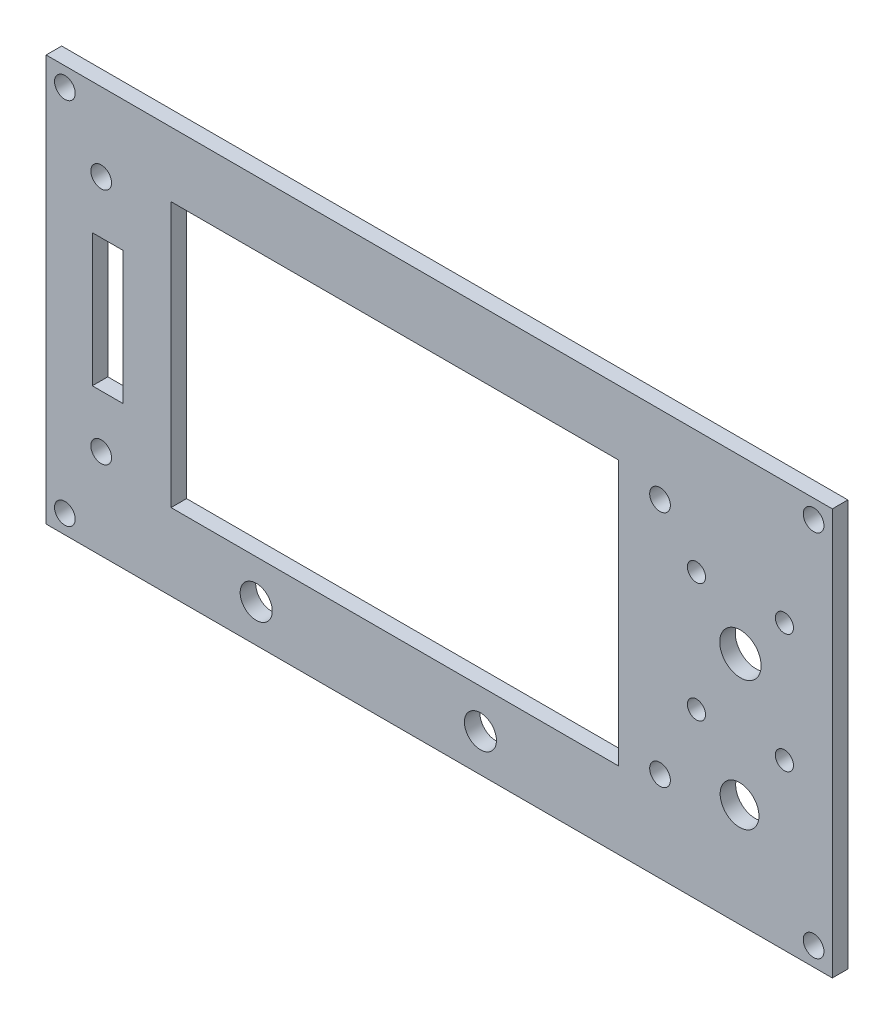
ISO-10303-21;
HEADER;
FILE_DESCRIPTION(('STEP AP214'),'2;1');
FILE_NAME('part.step','',(''),(''),'','','');
FILE_SCHEMA(('AUTOMOTIVE_DESIGN { 1 0 10303 214 1 1 1 1 }'));
ENDSEC;
DATA;
#1=APPLICATION_CONTEXT('core data for automotive mechanical design processes');
#2=APPLICATION_PROTOCOL_DEFINITION('international standard','automotive_design',2000,#1);
#3=PRODUCT_CONTEXT('',#1,'mechanical');
#4=PRODUCT('Part','Part','',(#3));
#5=PRODUCT_RELATED_PRODUCT_CATEGORY('part','',(#4));
#6=PRODUCT_DEFINITION_FORMATION('','',#4);
#7=PRODUCT_DEFINITION_CONTEXT('part definition',#1,'design');
#8=PRODUCT_DEFINITION('design','',#6,#7);
#9=PRODUCT_DEFINITION_SHAPE('','',#8);
#10=(LENGTH_UNIT() NAMED_UNIT(*) SI_UNIT(.MILLI.,.METRE.));
#11=(NAMED_UNIT(*) PLANE_ANGLE_UNIT() SI_UNIT($,.RADIAN.));
#12=(NAMED_UNIT(*) SI_UNIT($,.STERADIAN.) SOLID_ANGLE_UNIT());
#13=UNCERTAINTY_MEASURE_WITH_UNIT(LENGTH_MEASURE(1.E-05),#10,'distance_accuracy_value','');
#14=(GEOMETRIC_REPRESENTATION_CONTEXT(3) GLOBAL_UNCERTAINTY_ASSIGNED_CONTEXT((#13)) GLOBAL_UNIT_ASSIGNED_CONTEXT((#10,
#11,#12)) REPRESENTATION_CONTEXT('',''));
#15=CARTESIAN_POINT('',(0.,0.,0.));
#16=DIRECTION('',(0.,0.,1.));
#17=DIRECTION('',(1.,0.,0.));
#18=AXIS2_PLACEMENT_3D('',#15,#16,#17);
#19=CARTESIAN_POINT('',(0.,0.,0.8));
#20=DIRECTION('',(0.,0.,1.));
#21=DIRECTION('',(1.,0.,0.));
#22=AXIS2_PLACEMENT_3D('',#19,#20,#21);
#23=PLANE('',#22);
#24=CARTESIAN_POINT('',(14.1765521793274,-18.6113828011496,0.8));
#25=DIRECTION('',(0.,0.,1.));
#26=DIRECTION('',(1.,0.,0.));
#27=AXIS2_PLACEMENT_3D('',#24,#25,#26);
#28=CIRCLE('',#27,3.75);
#29=CARTESIAN_POINT('',(17.9265521793274,-18.6113828011496,0.8));
#30=VERTEX_POINT('',#29);
#31=EDGE_CURVE('E541',#30,#30,#28,.T.);
#32=ORIENTED_EDGE('',*,*,#31,.F.);
#33=EDGE_LOOP('',(#32));
#34=FACE_BOUND('',#33,.T.);
#35=CARTESIAN_POINT('',(5.84522459718796,-6.79565746544466,0.8));
#36=DIRECTION('',(0.,0.,1.));
#37=DIRECTION('',(1.,0.,0.));
#38=AXIS2_PLACEMENT_3D('',#35,#36,#37);
#39=CIRCLE('',#38,1.75);
#40=CARTESIAN_POINT('',(7.59522459718796,-6.79565746544466,0.8));
#41=VERTEX_POINT('',#40);
#42=EDGE_CURVE('E553',#41,#41,#39,.T.);
#43=ORIENTED_EDGE('',*,*,#42,.F.);
#44=EDGE_LOOP('',(#43));
#45=FACE_BOUND('',#44,.T.);
#46=CARTESIAN_POINT('',(22.845224597188,16.2043425345553,0.8));
#47=DIRECTION('',(0.,0.,1.));
#48=DIRECTION('',(1.,0.,0.));
#49=AXIS2_PLACEMENT_3D('',#46,#47,#48);
#50=CIRCLE('',#49,1.75);
#51=CARTESIAN_POINT('',(24.595224597188,16.2043425345553,0.8));
#52=VERTEX_POINT('',#51);
#53=EDGE_CURVE('E565',#52,#52,#50,.T.);
#54=ORIENTED_EDGE('',*,*,#53,.F.);
#55=EDGE_LOOP('',(#54));
#56=FACE_BOUND('',#55,.T.);
#57=CARTESIAN_POINT('',(14.3452245971879,6.74985267444258,0.8));
#58=DIRECTION('',(0.,0.,1.));
#59=DIRECTION('',(1.,0.,0.));
#60=AXIS2_PLACEMENT_3D('',#57,#58,#59);
#61=CIRCLE('',#60,4.);
#62=CARTESIAN_POINT('',(18.3452245971879,6.74985267444258,0.8));
#63=VERTEX_POINT('',#62);
#64=EDGE_CURVE('E577',#63,#63,#61,.T.);
#65=ORIENTED_EDGE('',*,*,#64,.F.);
#66=EDGE_LOOP('',(#65));
#67=FACE_BOUND('',#66,.T.);
#68=CARTESIAN_POINT('',(28.4861733241856,36.2841708057384,0.8));
#69=DIRECTION('',(0.,0.,1.));
#70=DIRECTION('',(1.,0.,0.));
#71=AXIS2_PLACEMENT_3D('',#68,#69,#70);
#72=CIRCLE('',#71,2.);
#73=CARTESIAN_POINT('',(30.4861733241856,36.2841708057384,0.8));
#74=VERTEX_POINT('',#73);
#75=EDGE_CURVE('E589',#74,#74,#72,.T.);
#76=ORIENTED_EDGE('',*,*,#75,.F.);
#77=EDGE_LOOP('',(#76));
#78=FACE_BOUND('',#77,.T.);
#79=CARTESIAN_POINT('',(-116.210955208112,36.2841708057384,0.8));
#80=DIRECTION('',(0.,0.,1.));
#81=DIRECTION('',(1.,0.,0.));
#82=AXIS2_PLACEMENT_3D('',#79,#80,#81);
#83=CIRCLE('',#82,2.);
#84=CARTESIAN_POINT('',(-114.210955208112,36.2841708057384,0.8));
#85=VERTEX_POINT('',#84);
#86=EDGE_CURVE('E151',#85,#85,#83,.T.);
#87=ORIENTED_EDGE('',*,*,#86,.F.);
#88=EDGE_LOOP('',(#87));
#89=FACE_BOUND('',#88,.T.);
#90=CARTESIAN_POINT('',(-1.1944174376666,-21.1785714285714,0.8));
#91=DIRECTION('',(0.,0.,1.));
#92=DIRECTION('',(1.,0.,0.));
#93=AXIS2_PLACEMENT_3D('',#90,#91,#92);
#94=CIRCLE('',#93,2.);
#95=CARTESIAN_POINT('',(0.805582562333403,-21.1785714285714,0.8));
#96=VERTEX_POINT('',#95);
#97=EDGE_CURVE('E167',#96,#96,#94,.T.);
#98=ORIENTED_EDGE('',*,*,#97,.F.);
#99=EDGE_LOOP('',(#98));
#100=FACE_BOUND('',#99,.T.);
#101=CARTESIAN_POINT('',(-109.194417437667,24.8214285714286,0.8));
#102=DIRECTION('',(0.,0.,1.));
#103=DIRECTION('',(1.,0.,0.));
#104=AXIS2_PLACEMENT_3D('',#101,#102,#103);
#105=CIRCLE('',#104,2.);
#106=CARTESIAN_POINT('',(-107.194417437667,24.8214285714286,0.8));
#107=VERTEX_POINT('',#106);
#108=EDGE_CURVE('E179',#107,#107,#105,.T.);
#109=ORIENTED_EDGE('',*,*,#108,.F.);
#110=EDGE_LOOP('',(#109));
#111=FACE_BOUND('',#110,.T.);
#112=DIRECTION('',(0.,-1.,0.));
#113=VECTOR('',#112,1.);
#114=CARTESIAN_POINT('',(-119.832275551672,39.9054911492981,0.8));
#115=LINE('',#114,#113);
#116=CARTESIAN_POINT('',(-119.832275551672,39.9054911492981,0.8));
#117=VERTEX_POINT('',#116);
#118=CARTESIAN_POINT('',(-119.832275551672,-38.6113828011498,0.8));
#119=VERTEX_POINT('',#118);
#120=EDGE_CURVE('E216',#117,#119,#115,.T.);
#121=ORIENTED_EDGE('',*,*,#120,.T.);
#122=DIRECTION('',(1.,0.,0.));
#123=VECTOR('',#122,1.);
#124=CARTESIAN_POINT('',(-119.832275551672,-38.6113828011498,0.8));
#125=LINE('',#124,#123);
#126=CARTESIAN_POINT('',(32.1074936677452,-38.6113828011498,0.8));
#127=VERTEX_POINT('',#126);
#128=EDGE_CURVE('E219',#119,#127,#125,.T.);
#129=ORIENTED_EDGE('',*,*,#128,.T.);
#130=DIRECTION('',(0.,1.,0.));
#131=VECTOR('',#130,1.);
#132=CARTESIAN_POINT('',(32.1074936677452,39.9054911492981,0.8));
#133=LINE('',#132,#131);
#134=CARTESIAN_POINT('',(32.1074936677452,39.9054911492981,0.8));
#135=VERTEX_POINT('',#134);
#136=EDGE_CURVE('E222',#127,#135,#133,.T.);
#137=ORIENTED_EDGE('',*,*,#136,.T.);
#138=DIRECTION('',(-1.,0.,0.));
#139=VECTOR('',#138,1.);
#140=CARTESIAN_POINT('',(-119.832275551672,39.9054911492981,0.8));
#141=LINE('',#140,#139);
#142=EDGE_CURVE('E224',#135,#117,#141,.T.);
#143=ORIENTED_EDGE('',*,*,#142,.T.);
#144=EDGE_LOOP('',(#121,#129,#137,#143));
#145=FACE_BOUND('',#144,.T.);
#146=DIRECTION('',(1.,0.,0.));
#147=VECTOR('',#146,1.);
#148=CARTESIAN_POINT('',(-95.6944174376666,-23.7785714285714,0.8));
#149=LINE('',#148,#147);
#150=CARTESIAN_POINT('',(-95.6944174376666,-23.7785714285714,0.8));
#151=VERTEX_POINT('',#150);
#152=CARTESIAN_POINT('',(-9.19441743766659,-23.7785714285714,0.8));
#153=VERTEX_POINT('',#152);
#154=EDGE_CURVE('E187',#151,#153,#149,.T.);
#155=ORIENTED_EDGE('',*,*,#154,.F.);
#156=DIRECTION('',(0.,-1.,0.));
#157=VECTOR('',#156,1.);
#158=CARTESIAN_POINT('',(-95.6944174376666,27.4214285714286,0.8));
#159=LINE('',#158,#157);
#160=CARTESIAN_POINT('',(-95.6944174376666,27.4214285714286,0.8));
#161=VERTEX_POINT('',#160);
#162=EDGE_CURVE('E185',#161,#151,#159,.T.);
#163=ORIENTED_EDGE('',*,*,#162,.F.);
#164=DIRECTION('',(-1.,0.,0.));
#165=VECTOR('',#164,1.);
#166=CARTESIAN_POINT('',(-95.6944174376666,27.4214285714286,0.8));
#167=LINE('',#166,#165);
#168=CARTESIAN_POINT('',(-9.19441743766659,27.4214285714286,0.8));
#169=VERTEX_POINT('',#168);
#170=EDGE_CURVE('E193',#169,#161,#167,.T.);
#171=ORIENTED_EDGE('',*,*,#170,.F.);
#172=DIRECTION('',(0.,1.,0.));
#173=VECTOR('',#172,1.);
#174=CARTESIAN_POINT('',(-9.19441743766659,27.4214285714286,0.8));
#175=LINE('',#174,#173);
#176=EDGE_CURVE('E190',#153,#169,#175,.T.);
#177=ORIENTED_EDGE('',*,*,#176,.F.);
#178=EDGE_LOOP('',(#155,#163,#171,#177));
#179=FACE_BOUND('',#178,.T.);
#180=CARTESIAN_POINT('',(-109.194417437667,-21.1785714285714,0.8));
#181=DIRECTION('',(0.,0.,1.));
#182=DIRECTION('',(1.,0.,0.));
#183=AXIS2_PLACEMENT_3D('',#180,#181,#182);
#184=CIRCLE('',#183,2.);
#185=CARTESIAN_POINT('',(-107.194417437667,-21.1785714285714,0.8));
#186=VERTEX_POINT('',#185);
#187=EDGE_CURVE('E173',#186,#186,#184,.T.);
#188=ORIENTED_EDGE('',*,*,#187,.F.);
#189=EDGE_LOOP('',(#188));
#190=FACE_BOUND('',#189,.T.);
#191=CARTESIAN_POINT('',(-1.19441743766659,24.8214285714286,0.8));
#192=DIRECTION('',(0.,0.,1.));
#193=DIRECTION('',(1.,0.,0.));
#194=AXIS2_PLACEMENT_3D('',#191,#192,#193);
#195=CIRCLE('',#194,2.);
#196=CARTESIAN_POINT('',(0.805582562333415,24.8214285714286,0.8));
#197=VERTEX_POINT('',#196);
#198=EDGE_CURVE('E161',#197,#197,#195,.T.);
#199=ORIENTED_EDGE('',*,*,#198,.F.);
#200=EDGE_LOOP('',(#199));
#201=FACE_BOUND('',#200,.T.);
#202=DIRECTION('',(1.,0.,0.));
#203=VECTOR('',#202,1.);
#204=CARTESIAN_POINT('',(-110.9137133356,-11.005359583467,0.8));
#205=LINE('',#204,#203);
#206=CARTESIAN_POINT('',(-110.9137133356,-11.005359583467,0.8));
#207=VERTEX_POINT('',#206);
#208=CARTESIAN_POINT('',(-104.976147164938,-11.005359583467,0.8));
#209=VERTEX_POINT('',#208);
#210=EDGE_CURVE('E130',#207,#209,#205,.T.);
#211=ORIENTED_EDGE('',*,*,#210,.F.);
#212=DIRECTION('',(0.,-1.,0.));
#213=VECTOR('',#212,1.);
#214=CARTESIAN_POINT('',(-110.9137133356,14.6275480313434,0.8));
#215=LINE('',#214,#213);
#216=CARTESIAN_POINT('',(-110.9137133356,14.6275480313434,0.8));
#217=VERTEX_POINT('',#216);
#218=EDGE_CURVE('E122',#217,#207,#215,.T.);
#219=ORIENTED_EDGE('',*,*,#218,.F.);
#220=DIRECTION('',(-1.,0.,0.));
#221=VECTOR('',#220,1.);
#222=CARTESIAN_POINT('',(-110.9137133356,14.6275480313434,0.8));
#223=LINE('',#222,#221);
#224=CARTESIAN_POINT('',(-104.976147164938,14.6275480313434,0.8));
#225=VERTEX_POINT('',#224);
#226=EDGE_CURVE('E145',#225,#217,#223,.T.);
#227=ORIENTED_EDGE('',*,*,#226,.F.);
#228=DIRECTION('',(0.,1.,0.));
#229=VECTOR('',#228,1.);
#230=CARTESIAN_POINT('',(-104.976147164938,14.6275480313434,0.8));
#231=LINE('',#230,#229);
#232=EDGE_CURVE('E143',#209,#225,#231,.T.);
#233=ORIENTED_EDGE('',*,*,#232,.F.);
#234=EDGE_LOOP('',(#211,#219,#227,#233));
#235=FACE_BOUND('',#234,.T.);
#236=CARTESIAN_POINT('',(-116.210955208112,-34.9900624575901,0.8));
#237=DIRECTION('',(0.,0.,1.));
#238=DIRECTION('',(1.,0.,0.));
#239=AXIS2_PLACEMENT_3D('',#236,#237,#238);
#240=CIRCLE('',#239,2.);
#241=CARTESIAN_POINT('',(-114.210955208112,-34.9900624575901,0.8));
#242=VERTEX_POINT('',#241);
#243=EDGE_CURVE('E595',#242,#242,#240,.T.);
#244=ORIENTED_EDGE('',*,*,#243,.F.);
#245=EDGE_LOOP('',(#244));
#246=FACE_BOUND('',#245,.T.);
#247=CARTESIAN_POINT('',(28.4861733241856,-34.9900624575901,0.8));
#248=DIRECTION('',(0.,0.,1.));
#249=DIRECTION('',(1.,0.,0.));
#250=AXIS2_PLACEMENT_3D('',#247,#248,#249);
#251=CIRCLE('',#250,2.00000000000001);
#252=CARTESIAN_POINT('',(30.4861733241856,-34.9900624575901,0.8));
#253=VERTEX_POINT('',#252);
#254=EDGE_CURVE('E583',#253,#253,#251,.T.);
#255=ORIENTED_EDGE('',*,*,#254,.F.);
#256=EDGE_LOOP('',(#255));
#257=FACE_BOUND('',#256,.T.);
#258=CARTESIAN_POINT('',(5.84522459718796,16.2043425345553,0.8));
#259=DIRECTION('',(0.,0.,1.));
#260=DIRECTION('',(1.,0.,0.));
#261=AXIS2_PLACEMENT_3D('',#258,#259,#260);
#262=CIRCLE('',#261,1.75);
#263=CARTESIAN_POINT('',(7.59522459718796,16.2043425345553,0.8));
#264=VERTEX_POINT('',#263);
#265=EDGE_CURVE('E571',#264,#264,#262,.T.);
#266=ORIENTED_EDGE('',*,*,#265,.F.);
#267=EDGE_LOOP('',(#266));
#268=FACE_BOUND('',#267,.T.);
#269=CARTESIAN_POINT('',(22.845224597188,-6.79565746544467,0.8));
#270=DIRECTION('',(0.,0.,1.));
#271=DIRECTION('',(1.,0.,0.));
#272=AXIS2_PLACEMENT_3D('',#269,#270,#271);
#273=CIRCLE('',#272,1.75);
#274=CARTESIAN_POINT('',(24.595224597188,-6.79565746544467,0.8));
#275=VERTEX_POINT('',#274);
#276=EDGE_CURVE('E559',#275,#275,#273,.T.);
#277=ORIENTED_EDGE('',*,*,#276,.F.);
#278=EDGE_LOOP('',(#277));
#279=FACE_BOUND('',#278,.T.);
#280=CARTESIAN_POINT('',(-79.2375087091907,-31.3167182927098,0.8));
#281=DIRECTION('',(0.,0.,1.));
#282=DIRECTION('',(1.,0.,0.));
#283=AXIS2_PLACEMENT_3D('',#280,#281,#282);
#284=CIRCLE('',#283,3.1);
#285=CARTESIAN_POINT('',(-76.1375087091907,-31.3167182927098,0.8));
#286=VERTEX_POINT('',#285);
#287=EDGE_CURVE('E547',#286,#286,#284,.T.);
#288=ORIENTED_EDGE('',*,*,#287,.F.);
#289=EDGE_LOOP('',(#288));
#290=FACE_BOUND('',#289,.T.);
#291=CARTESIAN_POINT('',(-35.9055575731451,-31.3167182927098,0.8));
#292=DIRECTION('',(0.,0.,1.));
#293=DIRECTION('',(1.,0.,0.));
#294=AXIS2_PLACEMENT_3D('',#291,#292,#293);
#295=CIRCLE('',#294,3.1);
#296=CARTESIAN_POINT('',(-32.8055575731451,-31.3167182927098,0.8));
#297=VERTEX_POINT('',#296);
#298=EDGE_CURVE('E532',#297,#297,#295,.T.);
#299=ORIENTED_EDGE('',*,*,#298,.F.);
#300=EDGE_LOOP('',(#299));
#301=FACE_BOUND('',#300,.T.);
#302=ADVANCED_FACE('F33',(#34,#45,#56,#67,#78,#89,#100,#111,#145,#179,#190,#201,#235,#246,#257,
#268,#279,#290,#301),#23,.T.);
#303=CARTESIAN_POINT('',(0.,0.,-2.2));
#304=DIRECTION('',(0.,0.,1.));
#305=DIRECTION('',(1.,0.,0.));
#306=AXIS2_PLACEMENT_3D('',#303,#304,#305);
#307=PLANE('',#306);
#308=CARTESIAN_POINT('',(-1.19441743766659,24.8214285714286,-2.2));
#309=DIRECTION('',(0.,0.,1.));
#310=DIRECTION('',(1.,0.,0.));
#311=AXIS2_PLACEMENT_3D('',#308,#309,#310);
#312=CIRCLE('',#311,2.);
#313=CARTESIAN_POINT('',(0.805582562333415,24.8214285714286,-2.2));
#314=VERTEX_POINT('',#313);
#315=EDGE_CURVE('E138',#314,#314,#312,.T.);
#316=ORIENTED_EDGE('',*,*,#315,.T.);
#317=EDGE_LOOP('',(#316));
#318=FACE_BOUND('',#317,.T.);
#319=CARTESIAN_POINT('',(-1.1944174376666,-21.1785714285714,-2.2));
#320=DIRECTION('',(0.,0.,1.));
#321=DIRECTION('',(1.,0.,0.));
#322=AXIS2_PLACEMENT_3D('',#319,#320,#321);
#323=CIRCLE('',#322,2.);
#324=CARTESIAN_POINT('',(0.805582562333403,-21.1785714285714,-2.2));
#325=VERTEX_POINT('',#324);
#326=EDGE_CURVE('E164',#325,#325,#323,.T.);
#327=ORIENTED_EDGE('',*,*,#326,.T.);
#328=EDGE_LOOP('',(#327));
#329=FACE_BOUND('',#328,.T.);
#330=CARTESIAN_POINT('',(-109.194417437667,-21.1785714285714,-2.2));
#331=DIRECTION('',(0.,0.,1.));
#332=DIRECTION('',(1.,0.,0.));
#333=AXIS2_PLACEMENT_3D('',#330,#331,#332);
#334=CIRCLE('',#333,2.);
#335=CARTESIAN_POINT('',(-107.194417437667,-21.1785714285714,-2.2));
#336=VERTEX_POINT('',#335);
#337=EDGE_CURVE('E170',#336,#336,#334,.T.);
#338=ORIENTED_EDGE('',*,*,#337,.T.);
#339=EDGE_LOOP('',(#338));
#340=FACE_BOUND('',#339,.T.);
#341=CARTESIAN_POINT('',(-109.194417437667,24.8214285714286,-2.2));
#342=DIRECTION('',(0.,0.,1.));
#343=DIRECTION('',(1.,0.,0.));
#344=AXIS2_PLACEMENT_3D('',#341,#342,#343);
#345=CIRCLE('',#344,2.);
#346=CARTESIAN_POINT('',(-107.194417437667,24.8214285714286,-2.2));
#347=VERTEX_POINT('',#346);
#348=EDGE_CURVE('E176',#347,#347,#345,.T.);
#349=ORIENTED_EDGE('',*,*,#348,.T.);
#350=EDGE_LOOP('',(#349));
#351=FACE_BOUND('',#350,.T.);
#352=DIRECTION('',(0.,-1.,0.));
#353=VECTOR('',#352,1.);
#354=CARTESIAN_POINT('',(-95.6944174376666,27.4214285714286,-2.2));
#355=LINE('',#354,#353);
#356=CARTESIAN_POINT('',(-95.6944174376666,27.4214285714286,-2.2));
#357=VERTEX_POINT('',#356);
#358=CARTESIAN_POINT('',(-95.6944174376666,-23.7785714285714,-2.2));
#359=VERTEX_POINT('',#358);
#360=EDGE_CURVE('E182',#357,#359,#355,.T.);
#361=ORIENTED_EDGE('',*,*,#360,.T.);
#362=DIRECTION('',(1.,0.,0.));
#363=VECTOR('',#362,1.);
#364=CARTESIAN_POINT('',(-95.6944174376666,-23.7785714285714,-2.2));
#365=LINE('',#364,#363);
#366=CARTESIAN_POINT('',(-9.19441743766659,-23.7785714285714,-2.2));
#367=VERTEX_POINT('',#366);
#368=EDGE_CURVE('E198',#359,#367,#365,.T.);
#369=ORIENTED_EDGE('',*,*,#368,.T.);
#370=DIRECTION('',(0.,1.,0.));
#371=VECTOR('',#370,1.);
#372=CARTESIAN_POINT('',(-9.19441743766659,27.4214285714286,-2.2));
#373=LINE('',#372,#371);
#374=CARTESIAN_POINT('',(-9.19441743766659,27.4214285714286,-2.2));
#375=VERTEX_POINT('',#374);
#376=EDGE_CURVE('E201',#367,#375,#373,.T.);
#377=ORIENTED_EDGE('',*,*,#376,.T.);
#378=DIRECTION('',(-1.,0.,0.));
#379=VECTOR('',#378,1.);
#380=CARTESIAN_POINT('',(-95.6944174376666,27.4214285714286,-2.2));
#381=LINE('',#380,#379);
#382=EDGE_CURVE('E188',#375,#357,#381,.T.);
#383=ORIENTED_EDGE('',*,*,#382,.T.);
#384=EDGE_LOOP('',(#361,#369,#377,#383));
#385=FACE_BOUND('',#384,.T.);
#386=DIRECTION('',(0.,-1.,0.));
#387=VECTOR('',#386,1.);
#388=CARTESIAN_POINT('',(-119.832275551672,39.9054911492981,-2.2));
#389=LINE('',#388,#387);
#390=CARTESIAN_POINT('',(-119.832275551672,39.9054911492981,-2.2));
#391=VERTEX_POINT('',#390);
#392=CARTESIAN_POINT('',(-119.832275551672,-38.6113828011498,-2.2));
#393=VERTEX_POINT('',#392);
#394=EDGE_CURVE('E215',#391,#393,#389,.T.);
#395=ORIENTED_EDGE('',*,*,#394,.F.);
#396=DIRECTION('',(-1.,0.,0.));
#397=VECTOR('',#396,1.);
#398=CARTESIAN_POINT('',(-119.832275551672,39.9054911492981,-2.2));
#399=LINE('',#398,#397);
#400=CARTESIAN_POINT('',(32.1074936677452,39.9054911492981,-2.2));
#401=VERTEX_POINT('',#400);
#402=EDGE_CURVE('E220',#401,#391,#399,.T.);
#403=ORIENTED_EDGE('',*,*,#402,.F.);
#404=DIRECTION('',(0.,1.,0.));
#405=VECTOR('',#404,1.);
#406=CARTESIAN_POINT('',(32.1074936677452,39.9054911492981,-2.2));
#407=LINE('',#406,#405);
#408=CARTESIAN_POINT('',(32.1074936677452,-38.6113828011498,-2.2));
#409=VERTEX_POINT('',#408);
#410=EDGE_CURVE('E231',#409,#401,#407,.T.);
#411=ORIENTED_EDGE('',*,*,#410,.F.);
#412=DIRECTION('',(1.,0.,0.));
#413=VECTOR('',#412,1.);
#414=CARTESIAN_POINT('',(-119.832275551672,-38.6113828011498,-2.2));
#415=LINE('',#414,#413);
#416=EDGE_CURVE('E229',#393,#409,#415,.T.);
#417=ORIENTED_EDGE('',*,*,#416,.F.);
#418=EDGE_LOOP('',(#395,#403,#411,#417));
#419=FACE_BOUND('',#418,.T.);
#420=DIRECTION('',(0.,-1.,0.));
#421=VECTOR('',#420,1.);
#422=CARTESIAN_POINT('',(-110.9137133356,14.6275480313434,-2.2));
#423=LINE('',#422,#421);
#424=CARTESIAN_POINT('',(-110.9137133356,14.6275480313434,-2.2));
#425=VERTEX_POINT('',#424);
#426=CARTESIAN_POINT('',(-110.9137133356,-11.005359583467,-2.2));
#427=VERTEX_POINT('',#426);
#428=EDGE_CURVE('E56',#425,#427,#423,.T.);
#429=ORIENTED_EDGE('',*,*,#428,.T.);
#430=DIRECTION('',(1.,0.,0.));
#431=VECTOR('',#430,1.);
#432=CARTESIAN_POINT('',(-110.9137133356,-11.005359583467,-2.2));
#433=LINE('',#432,#431);
#434=CARTESIAN_POINT('',(-104.976147164938,-11.005359583467,-2.2));
#435=VERTEX_POINT('',#434);
#436=EDGE_CURVE('E137',#427,#435,#433,.T.);
#437=ORIENTED_EDGE('',*,*,#436,.T.);
#438=DIRECTION('',(0.,1.,0.));
#439=VECTOR('',#438,1.);
#440=CARTESIAN_POINT('',(-104.976147164938,14.6275480313434,-2.2));
#441=LINE('',#440,#439);
#442=CARTESIAN_POINT('',(-104.976147164938,14.6275480313434,-2.2));
#443=VERTEX_POINT('',#442);
#444=EDGE_CURVE('E153',#435,#443,#441,.T.);
#445=ORIENTED_EDGE('',*,*,#444,.T.);
#446=DIRECTION('',(-1.,0.,0.));
#447=VECTOR('',#446,1.);
#448=CARTESIAN_POINT('',(-110.9137133356,14.6275480313434,-2.2));
#449=LINE('',#448,#447);
#450=EDGE_CURVE('E131',#443,#425,#449,.T.);
#451=ORIENTED_EDGE('',*,*,#450,.T.);
#452=EDGE_LOOP('',(#429,#437,#445,#451));
#453=FACE_BOUND('',#452,.T.);
#454=CARTESIAN_POINT('',(-116.210955208112,36.2841708057384,-2.2));
#455=DIRECTION('',(0.,0.,1.));
#456=DIRECTION('',(1.,0.,0.));
#457=AXIS2_PLACEMENT_3D('',#454,#455,#456);
#458=CIRCLE('',#457,2.);
#459=CARTESIAN_POINT('',(-114.210955208112,36.2841708057384,-2.2));
#460=VERTEX_POINT('',#459);
#461=EDGE_CURVE('E598',#460,#460,#458,.T.);
#462=ORIENTED_EDGE('',*,*,#461,.T.);
#463=EDGE_LOOP('',(#462));
#464=FACE_BOUND('',#463,.T.);
#465=CARTESIAN_POINT('',(-116.210955208112,-34.9900624575901,-2.2));
#466=DIRECTION('',(0.,0.,1.));
#467=DIRECTION('',(1.,0.,0.));
#468=AXIS2_PLACEMENT_3D('',#465,#466,#467);
#469=CIRCLE('',#468,2.);
#470=CARTESIAN_POINT('',(-114.210955208112,-34.9900624575901,-2.2));
#471=VERTEX_POINT('',#470);
#472=EDGE_CURVE('E592',#471,#471,#469,.T.);
#473=ORIENTED_EDGE('',*,*,#472,.T.);
#474=EDGE_LOOP('',(#473));
#475=FACE_BOUND('',#474,.T.);
#476=CARTESIAN_POINT('',(28.4861733241856,36.2841708057384,-2.2));
#477=DIRECTION('',(0.,0.,1.));
#478=DIRECTION('',(1.,0.,0.));
#479=AXIS2_PLACEMENT_3D('',#476,#477,#478);
#480=CIRCLE('',#479,2.);
#481=CARTESIAN_POINT('',(30.4861733241856,36.2841708057384,-2.2));
#482=VERTEX_POINT('',#481);
#483=EDGE_CURVE('E586',#482,#482,#480,.T.);
#484=ORIENTED_EDGE('',*,*,#483,.T.);
#485=EDGE_LOOP('',(#484));
#486=FACE_BOUND('',#485,.T.);
#487=CARTESIAN_POINT('',(28.4861733241856,-34.9900624575901,-2.2));
#488=DIRECTION('',(0.,0.,1.));
#489=DIRECTION('',(1.,0.,0.));
#490=AXIS2_PLACEMENT_3D('',#487,#488,#489);
#491=CIRCLE('',#490,2.00000000000001);
#492=CARTESIAN_POINT('',(30.4861733241856,-34.9900624575901,-2.2));
#493=VERTEX_POINT('',#492);
#494=EDGE_CURVE('E580',#493,#493,#491,.T.);
#495=ORIENTED_EDGE('',*,*,#494,.T.);
#496=EDGE_LOOP('',(#495));
#497=FACE_BOUND('',#496,.T.);
#498=CARTESIAN_POINT('',(14.3452245971879,6.74985267444258,-2.2));
#499=DIRECTION('',(0.,0.,1.));
#500=DIRECTION('',(1.,0.,0.));
#501=AXIS2_PLACEMENT_3D('',#498,#499,#500);
#502=CIRCLE('',#501,4.);
#503=CARTESIAN_POINT('',(18.3452245971879,6.74985267444258,-2.2));
#504=VERTEX_POINT('',#503);
#505=EDGE_CURVE('E574',#504,#504,#502,.T.);
#506=ORIENTED_EDGE('',*,*,#505,.T.);
#507=EDGE_LOOP('',(#506));
#508=FACE_BOUND('',#507,.T.);
#509=CARTESIAN_POINT('',(5.84522459718796,16.2043425345553,-2.2));
#510=DIRECTION('',(0.,0.,1.));
#511=DIRECTION('',(1.,0.,0.));
#512=AXIS2_PLACEMENT_3D('',#509,#510,#511);
#513=CIRCLE('',#512,1.75);
#514=CARTESIAN_POINT('',(7.59522459718796,16.2043425345553,-2.2));
#515=VERTEX_POINT('',#514);
#516=EDGE_CURVE('E568',#515,#515,#513,.T.);
#517=ORIENTED_EDGE('',*,*,#516,.T.);
#518=EDGE_LOOP('',(#517));
#519=FACE_BOUND('',#518,.T.);
#520=CARTESIAN_POINT('',(22.845224597188,16.2043425345553,-2.2));
#521=DIRECTION('',(0.,0.,1.));
#522=DIRECTION('',(1.,0.,0.));
#523=AXIS2_PLACEMENT_3D('',#520,#521,#522);
#524=CIRCLE('',#523,1.75);
#525=CARTESIAN_POINT('',(24.595224597188,16.2043425345553,-2.2));
#526=VERTEX_POINT('',#525);
#527=EDGE_CURVE('E562',#526,#526,#524,.T.);
#528=ORIENTED_EDGE('',*,*,#527,.T.);
#529=EDGE_LOOP('',(#528));
#530=FACE_BOUND('',#529,.T.);
#531=CARTESIAN_POINT('',(22.845224597188,-6.79565746544467,-2.2));
#532=DIRECTION('',(0.,0.,1.));
#533=DIRECTION('',(1.,0.,0.));
#534=AXIS2_PLACEMENT_3D('',#531,#532,#533);
#535=CIRCLE('',#534,1.75);
#536=CARTESIAN_POINT('',(24.595224597188,-6.79565746544467,-2.2));
#537=VERTEX_POINT('',#536);
#538=EDGE_CURVE('E556',#537,#537,#535,.T.);
#539=ORIENTED_EDGE('',*,*,#538,.T.);
#540=EDGE_LOOP('',(#539));
#541=FACE_BOUND('',#540,.T.);
#542=CARTESIAN_POINT('',(5.84522459718796,-6.79565746544466,-2.2));
#543=DIRECTION('',(0.,0.,1.));
#544=DIRECTION('',(1.,0.,0.));
#545=AXIS2_PLACEMENT_3D('',#542,#543,#544);
#546=CIRCLE('',#545,1.75);
#547=CARTESIAN_POINT('',(7.59522459718796,-6.79565746544466,-2.2));
#548=VERTEX_POINT('',#547);
#549=EDGE_CURVE('E550',#548,#548,#546,.T.);
#550=ORIENTED_EDGE('',*,*,#549,.T.);
#551=EDGE_LOOP('',(#550));
#552=FACE_BOUND('',#551,.T.);
#553=CARTESIAN_POINT('',(-79.2375087091907,-31.3167182927098,-2.2));
#554=DIRECTION('',(0.,0.,1.));
#555=DIRECTION('',(1.,0.,0.));
#556=AXIS2_PLACEMENT_3D('',#553,#554,#555);
#557=CIRCLE('',#556,3.1);
#558=CARTESIAN_POINT('',(-76.1375087091907,-31.3167182927098,-2.2));
#559=VERTEX_POINT('',#558);
#560=EDGE_CURVE('E544',#559,#559,#557,.T.);
#561=ORIENTED_EDGE('',*,*,#560,.T.);
#562=EDGE_LOOP('',(#561));
#563=FACE_BOUND('',#562,.T.);
#564=CARTESIAN_POINT('',(14.1765521793274,-18.6113828011496,-2.2));
#565=DIRECTION('',(0.,0.,1.));
#566=DIRECTION('',(1.,0.,0.));
#567=AXIS2_PLACEMENT_3D('',#564,#565,#566);
#568=CIRCLE('',#567,3.75);
#569=CARTESIAN_POINT('',(17.9265521793274,-18.6113828011496,-2.2));
#570=VERTEX_POINT('',#569);
#571=EDGE_CURVE('E538',#570,#570,#568,.T.);
#572=ORIENTED_EDGE('',*,*,#571,.T.);
#573=EDGE_LOOP('',(#572));
#574=FACE_BOUND('',#573,.T.);
#575=CARTESIAN_POINT('',(-35.9055575731451,-31.3167182927098,-2.2));
#576=DIRECTION('',(0.,0.,1.));
#577=DIRECTION('',(1.,0.,0.));
#578=AXIS2_PLACEMENT_3D('',#575,#576,#577);
#579=CIRCLE('',#578,3.1);
#580=CARTESIAN_POINT('',(-32.8055575731451,-31.3167182927098,-2.2));
#581=VERTEX_POINT('',#580);
#582=EDGE_CURVE('E535',#581,#581,#579,.T.);
#583=ORIENTED_EDGE('',*,*,#582,.T.);
#584=EDGE_LOOP('',(#583));
#585=FACE_BOUND('',#584,.T.);
#586=ADVANCED_FACE('F249',(#318,#329,#340,#351,#385,#419,#453,#464,#475,#486,#497,#508,#519,
#530,#541,#552,#563,#574,#585),#307,.F.);
#587=CARTESIAN_POINT('',(-119.832275551672,39.9054911492981,0.8));
#588=DIRECTION('',(1.,0.,0.));
#589=DIRECTION('',(0.,0.,-1.));
#590=AXIS2_PLACEMENT_3D('',#587,#588,#589);
#591=PLANE('',#590);
#592=ORIENTED_EDGE('',*,*,#394,.T.);
#593=DIRECTION('',(0.,0.,-1.));
#594=VECTOR('',#593,1.);
#595=CARTESIAN_POINT('',(-119.832275551672,-38.6113828011498,0.8));
#596=LINE('',#595,#594);
#597=EDGE_CURVE('E11',#119,#393,#596,.T.);
#598=ORIENTED_EDGE('',*,*,#597,.F.);
#599=ORIENTED_EDGE('',*,*,#120,.F.);
#600=DIRECTION('',(0.,0.,-1.));
#601=VECTOR('',#600,1.);
#602=CARTESIAN_POINT('',(-119.832275551672,39.9054911492981,0.8));
#603=LINE('',#602,#601);
#604=EDGE_CURVE('E226',#117,#391,#603,.T.);
#605=ORIENTED_EDGE('',*,*,#604,.T.);
#606=EDGE_LOOP('',(#592,#598,#599,#605));
#607=FACE_BOUND('',#606,.T.);
#608=ADVANCED_FACE('F35',(#607),#591,.F.);
#609=CARTESIAN_POINT('',(-119.832275551672,-38.6113828011498,0.8));
#610=DIRECTION('',(0.,1.,0.));
#611=DIRECTION('',(0.,0.,1.));
#612=AXIS2_PLACEMENT_3D('',#609,#610,#611);
#613=PLANE('',#612);
#614=ORIENTED_EDGE('',*,*,#416,.T.);
#615=DIRECTION('',(0.,0.,-1.));
#616=VECTOR('',#615,1.);
#617=CARTESIAN_POINT('',(32.1074936677452,-38.6113828011498,0.8));
#618=LINE('',#617,#616);
#619=EDGE_CURVE('E41',#127,#409,#618,.T.);
#620=ORIENTED_EDGE('',*,*,#619,.F.);
#621=ORIENTED_EDGE('',*,*,#128,.F.);
#622=ORIENTED_EDGE('',*,*,#597,.T.);
#623=EDGE_LOOP('',(#614,#620,#621,#622));
#624=FACE_BOUND('',#623,.T.);
#625=ADVANCED_FACE('F260',(#624),#613,.F.);
#626=CARTESIAN_POINT('',(32.1074936677452,39.9054911492981,0.8));
#627=DIRECTION('',(-1.,0.,0.));
#628=DIRECTION('',(0.,0.,1.));
#629=AXIS2_PLACEMENT_3D('',#626,#627,#628);
#630=PLANE('',#629);
#631=ORIENTED_EDGE('',*,*,#410,.T.);
#632=DIRECTION('',(0.,0.,-1.));
#633=VECTOR('',#632,1.);
#634=CARTESIAN_POINT('',(32.1074936677452,39.9054911492981,0.8));
#635=LINE('',#634,#633);
#636=EDGE_CURVE('E236',#135,#401,#635,.T.);
#637=ORIENTED_EDGE('',*,*,#636,.F.);
#638=ORIENTED_EDGE('',*,*,#136,.F.);
#639=ORIENTED_EDGE('',*,*,#619,.T.);
#640=EDGE_LOOP('',(#631,#637,#638,#639));
#641=FACE_BOUND('',#640,.T.);
#642=ADVANCED_FACE('F243',(#641),#630,.F.);
#643=CARTESIAN_POINT('',(-119.832275551672,39.9054911492981,0.8));
#644=DIRECTION('',(0.,-1.,0.));
#645=DIRECTION('',(0.,0.,-1.));
#646=AXIS2_PLACEMENT_3D('',#643,#644,#645);
#647=PLANE('',#646);
#648=ORIENTED_EDGE('',*,*,#402,.T.);
#649=ORIENTED_EDGE('',*,*,#604,.F.);
#650=ORIENTED_EDGE('',*,*,#142,.F.);
#651=ORIENTED_EDGE('',*,*,#636,.T.);
#652=EDGE_LOOP('',(#648,#649,#650,#651));
#653=FACE_BOUND('',#652,.T.);
#654=ADVANCED_FACE('F253',(#653),#647,.F.);
#655=CARTESIAN_POINT('',(-95.6944174376666,27.4214285714286,0.8));
#656=DIRECTION('',(1.,0.,0.));
#657=DIRECTION('',(0.,0.,-1.));
#658=AXIS2_PLACEMENT_3D('',#655,#656,#657);
#659=PLANE('',#658);
#660=ORIENTED_EDGE('',*,*,#360,.F.);
#661=DIRECTION('',(0.,0.,-1.));
#662=VECTOR('',#661,1.);
#663=CARTESIAN_POINT('',(-95.6944174376666,27.4214285714286,0.8));
#664=LINE('',#663,#662);
#665=EDGE_CURVE('E195',#161,#357,#664,.T.);
#666=ORIENTED_EDGE('',*,*,#665,.F.);
#667=ORIENTED_EDGE('',*,*,#162,.T.);
#668=DIRECTION('',(0.,0.,-1.));
#669=VECTOR('',#668,1.);
#670=CARTESIAN_POINT('',(-95.6944174376666,-23.7785714285714,0.8));
#671=LINE('',#670,#669);
#672=EDGE_CURVE('E212',#151,#359,#671,.T.);
#673=ORIENTED_EDGE('',*,*,#672,.T.);
#674=EDGE_LOOP('',(#660,#666,#667,#673));
#675=FACE_BOUND('',#674,.T.);
#676=ADVANCED_FACE('F278',(#675),#659,.T.);
#677=CARTESIAN_POINT('',(-95.6944174376666,-23.7785714285714,0.8));
#678=DIRECTION('',(0.,1.,0.));
#679=DIRECTION('',(0.,0.,1.));
#680=AXIS2_PLACEMENT_3D('',#677,#678,#679);
#681=PLANE('',#680);
#682=ORIENTED_EDGE('',*,*,#368,.F.);
#683=ORIENTED_EDGE('',*,*,#672,.F.);
#684=ORIENTED_EDGE('',*,*,#154,.T.);
#685=DIRECTION('',(0.,0.,-1.));
#686=VECTOR('',#685,1.);
#687=CARTESIAN_POINT('',(-9.19441743766659,-23.7785714285714,0.8));
#688=LINE('',#687,#686);
#689=EDGE_CURVE('E210',#153,#367,#688,.T.);
#690=ORIENTED_EDGE('',*,*,#689,.T.);
#691=EDGE_LOOP('',(#682,#683,#684,#690));
#692=FACE_BOUND('',#691,.T.);
#693=ADVANCED_FACE('F285',(#692),#681,.T.);
#694=CARTESIAN_POINT('',(-9.19441743766659,27.4214285714286,0.8));
#695=DIRECTION('',(-1.,0.,0.));
#696=DIRECTION('',(0.,0.,1.));
#697=AXIS2_PLACEMENT_3D('',#694,#695,#696);
#698=PLANE('',#697);
#699=ORIENTED_EDGE('',*,*,#376,.F.);
#700=ORIENTED_EDGE('',*,*,#689,.F.);
#701=ORIENTED_EDGE('',*,*,#176,.T.);
#702=DIRECTION('',(0.,0.,-1.));
#703=VECTOR('',#702,1.);
#704=CARTESIAN_POINT('',(-9.19441743766659,27.4214285714286,0.8));
#705=LINE('',#704,#703);
#706=EDGE_CURVE('E208',#169,#375,#705,.T.);
#707=ORIENTED_EDGE('',*,*,#706,.T.);
#708=EDGE_LOOP('',(#699,#700,#701,#707));
#709=FACE_BOUND('',#708,.T.);
#710=ADVANCED_FACE('F290',(#709),#698,.T.);
#711=CARTESIAN_POINT('',(-95.6944174376666,27.4214285714286,0.8));
#712=DIRECTION('',(0.,-1.,0.));
#713=DIRECTION('',(0.,0.,-1.));
#714=AXIS2_PLACEMENT_3D('',#711,#712,#713);
#715=PLANE('',#714);
#716=ORIENTED_EDGE('',*,*,#382,.F.);
#717=ORIENTED_EDGE('',*,*,#706,.F.);
#718=ORIENTED_EDGE('',*,*,#170,.T.);
#719=ORIENTED_EDGE('',*,*,#665,.T.);
#720=EDGE_LOOP('',(#716,#717,#718,#719));
#721=FACE_BOUND('',#720,.T.);
#722=ADVANCED_FACE('F298',(#721),#715,.T.);
#723=CARTESIAN_POINT('',(-109.194417437667,24.8214285714286,0.8));
#724=DIRECTION('',(0.,0.,-1.));
#725=DIRECTION('',(-1.,0.,0.));
#726=AXIS2_PLACEMENT_3D('',#723,#724,#725);
#727=CYLINDRICAL_SURFACE('',#726,2.);
#728=ORIENTED_EDGE('',*,*,#108,.T.);
#729=EDGE_LOOP('',(#728));
#730=FACE_BOUND('',#729,.T.);
#731=ORIENTED_EDGE('',*,*,#348,.F.);
#732=EDGE_LOOP('',(#731));
#733=FACE_BOUND('',#732,.T.);
#734=ADVANCED_FACE('F323',(#730,#733),#727,.F.);
#735=CARTESIAN_POINT('',(-109.194417437667,-21.1785714285714,0.8));
#736=DIRECTION('',(0.,0.,-1.));
#737=DIRECTION('',(-1.,0.,0.));
#738=AXIS2_PLACEMENT_3D('',#735,#736,#737);
#739=CYLINDRICAL_SURFACE('',#738,2.);
#740=ORIENTED_EDGE('',*,*,#187,.T.);
#741=EDGE_LOOP('',(#740));
#742=FACE_BOUND('',#741,.T.);
#743=ORIENTED_EDGE('',*,*,#337,.F.);
#744=EDGE_LOOP('',(#743));
#745=FACE_BOUND('',#744,.T.);
#746=ADVANCED_FACE('F325',(#742,#745),#739,.F.);
#747=CARTESIAN_POINT('',(-1.1944174376666,-21.1785714285714,0.8));
#748=DIRECTION('',(0.,0.,-1.));
#749=DIRECTION('',(-1.,0.,0.));
#750=AXIS2_PLACEMENT_3D('',#747,#748,#749);
#751=CYLINDRICAL_SURFACE('',#750,2.);
#752=ORIENTED_EDGE('',*,*,#97,.T.);
#753=EDGE_LOOP('',(#752));
#754=FACE_BOUND('',#753,.T.);
#755=ORIENTED_EDGE('',*,*,#326,.F.);
#756=EDGE_LOOP('',(#755));
#757=FACE_BOUND('',#756,.T.);
#758=ADVANCED_FACE('F313',(#754,#757),#751,.F.);
#759=CARTESIAN_POINT('',(-1.19441743766659,24.8214285714286,0.8));
#760=DIRECTION('',(0.,0.,-1.));
#761=DIRECTION('',(-1.,0.,0.));
#762=AXIS2_PLACEMENT_3D('',#759,#760,#761);
#763=CYLINDRICAL_SURFACE('',#762,2.);
#764=ORIENTED_EDGE('',*,*,#198,.T.);
#765=EDGE_LOOP('',(#764));
#766=FACE_BOUND('',#765,.T.);
#767=ORIENTED_EDGE('',*,*,#315,.F.);
#768=EDGE_LOOP('',(#767));
#769=FACE_BOUND('',#768,.T.);
#770=ADVANCED_FACE('F310',(#766,#769),#763,.F.);
#771=CARTESIAN_POINT('',(-110.9137133356,14.6275480313434,0.8));
#772=DIRECTION('',(1.,0.,0.));
#773=DIRECTION('',(0.,0.,-1.));
#774=AXIS2_PLACEMENT_3D('',#771,#772,#773);
#775=PLANE('',#774);
#776=ORIENTED_EDGE('',*,*,#428,.F.);
#777=DIRECTION('',(0.,0.,-1.));
#778=VECTOR('',#777,1.);
#779=CARTESIAN_POINT('',(-110.9137133356,14.6275480313434,0.8));
#780=LINE('',#779,#778);
#781=EDGE_CURVE('E126',#217,#425,#780,.T.);
#782=ORIENTED_EDGE('',*,*,#781,.F.);
#783=ORIENTED_EDGE('',*,*,#218,.T.);
#784=DIRECTION('',(0.,0.,-1.));
#785=VECTOR('',#784,1.);
#786=CARTESIAN_POINT('',(-110.9137133356,-11.005359583467,0.8));
#787=LINE('',#786,#785);
#788=EDGE_CURVE('E125',#207,#427,#787,.T.);
#789=ORIENTED_EDGE('',*,*,#788,.T.);
#790=EDGE_LOOP('',(#776,#782,#783,#789));
#791=FACE_BOUND('',#790,.T.);
#792=ADVANCED_FACE('F124',(#791),#775,.T.);
#793=CARTESIAN_POINT('',(-110.9137133356,-11.005359583467,0.8));
#794=DIRECTION('',(0.,1.,0.));
#795=DIRECTION('',(0.,0.,1.));
#796=AXIS2_PLACEMENT_3D('',#793,#794,#795);
#797=PLANE('',#796);
#798=ORIENTED_EDGE('',*,*,#436,.F.);
#799=ORIENTED_EDGE('',*,*,#788,.F.);
#800=ORIENTED_EDGE('',*,*,#210,.T.);
#801=DIRECTION('',(0.,0.,-1.));
#802=VECTOR('',#801,1.);
#803=CARTESIAN_POINT('',(-104.976147164938,-11.005359583467,0.8));
#804=LINE('',#803,#802);
#805=EDGE_CURVE('E139',#209,#435,#804,.T.);
#806=ORIENTED_EDGE('',*,*,#805,.T.);
#807=EDGE_LOOP('',(#798,#799,#800,#806));
#808=FACE_BOUND('',#807,.T.);
#809=ADVANCED_FACE('F134',(#808),#797,.T.);
#810=CARTESIAN_POINT('',(-104.976147164938,14.6275480313434,0.8));
#811=DIRECTION('',(-1.,0.,0.));
#812=DIRECTION('',(0.,0.,1.));
#813=AXIS2_PLACEMENT_3D('',#810,#811,#812);
#814=PLANE('',#813);
#815=ORIENTED_EDGE('',*,*,#444,.F.);
#816=ORIENTED_EDGE('',*,*,#805,.F.);
#817=ORIENTED_EDGE('',*,*,#232,.T.);
#818=DIRECTION('',(0.,0.,-1.));
#819=VECTOR('',#818,1.);
#820=CARTESIAN_POINT('',(-104.976147164938,14.6275480313434,0.8));
#821=LINE('',#820,#819);
#822=EDGE_CURVE('E48',#225,#443,#821,.T.);
#823=ORIENTED_EDGE('',*,*,#822,.T.);
#824=EDGE_LOOP('',(#815,#816,#817,#823));
#825=FACE_BOUND('',#824,.T.);
#826=ADVANCED_FACE('F387',(#825),#814,.T.);
#827=CARTESIAN_POINT('',(-110.9137133356,14.6275480313434,0.8));
#828=DIRECTION('',(0.,-1.,0.));
#829=DIRECTION('',(0.,0.,-1.));
#830=AXIS2_PLACEMENT_3D('',#827,#828,#829);
#831=PLANE('',#830);
#832=ORIENTED_EDGE('',*,*,#450,.F.);
#833=ORIENTED_EDGE('',*,*,#822,.F.);
#834=ORIENTED_EDGE('',*,*,#226,.T.);
#835=ORIENTED_EDGE('',*,*,#781,.T.);
#836=EDGE_LOOP('',(#832,#833,#834,#835));
#837=FACE_BOUND('',#836,.T.);
#838=ADVANCED_FACE('F396',(#837),#831,.T.);
#839=CARTESIAN_POINT('',(-116.210955208112,36.2841708057384,0.8));
#840=DIRECTION('',(0.,0.,-1.));
#841=DIRECTION('',(-1.,0.,0.));
#842=AXIS2_PLACEMENT_3D('',#839,#840,#841);
#843=CYLINDRICAL_SURFACE('',#842,2.);
#844=ORIENTED_EDGE('',*,*,#86,.T.);
#845=EDGE_LOOP('',(#844));
#846=FACE_BOUND('',#845,.T.);
#847=ORIENTED_EDGE('',*,*,#461,.F.);
#848=EDGE_LOOP('',(#847));
#849=FACE_BOUND('',#848,.T.);
#850=ADVANCED_FACE('F406',(#846,#849),#843,.F.);
#851=CARTESIAN_POINT('',(-116.210955208112,-34.9900624575901,0.8));
#852=DIRECTION('',(0.,0.,-1.));
#853=DIRECTION('',(-1.,0.,0.));
#854=AXIS2_PLACEMENT_3D('',#851,#852,#853);
#855=CYLINDRICAL_SURFACE('',#854,2.);
#856=ORIENTED_EDGE('',*,*,#243,.T.);
#857=EDGE_LOOP('',(#856));
#858=FACE_BOUND('',#857,.T.);
#859=ORIENTED_EDGE('',*,*,#472,.F.);
#860=EDGE_LOOP('',(#859));
#861=FACE_BOUND('',#860,.T.);
#862=ADVANCED_FACE('F415',(#858,#861),#855,.F.);
#863=CARTESIAN_POINT('',(28.4861733241856,36.2841708057384,0.8));
#864=DIRECTION('',(0.,0.,-1.));
#865=DIRECTION('',(-1.,0.,0.));
#866=AXIS2_PLACEMENT_3D('',#863,#864,#865);
#867=CYLINDRICAL_SURFACE('',#866,2.);
#868=ORIENTED_EDGE('',*,*,#75,.T.);
#869=EDGE_LOOP('',(#868));
#870=FACE_BOUND('',#869,.T.);
#871=ORIENTED_EDGE('',*,*,#483,.F.);
#872=EDGE_LOOP('',(#871));
#873=FACE_BOUND('',#872,.T.);
#874=ADVANCED_FACE('F425',(#870,#873),#867,.F.);
#875=CARTESIAN_POINT('',(28.4861733241856,-34.9900624575901,0.8));
#876=DIRECTION('',(0.,0.,-1.));
#877=DIRECTION('',(-1.,0.,0.));
#878=AXIS2_PLACEMENT_3D('',#875,#876,#877);
#879=CYLINDRICAL_SURFACE('',#878,2.00000000000001);
#880=ORIENTED_EDGE('',*,*,#254,.T.);
#881=EDGE_LOOP('',(#880));
#882=FACE_BOUND('',#881,.T.);
#883=ORIENTED_EDGE('',*,*,#494,.F.);
#884=EDGE_LOOP('',(#883));
#885=FACE_BOUND('',#884,.T.);
#886=ADVANCED_FACE('F435',(#882,#885),#879,.F.);
#887=CARTESIAN_POINT('',(14.3452245971879,6.74985267444258,0.8));
#888=DIRECTION('',(0.,0.,-1.));
#889=DIRECTION('',(-1.,0.,0.));
#890=AXIS2_PLACEMENT_3D('',#887,#888,#889);
#891=CYLINDRICAL_SURFACE('',#890,4.);
#892=ORIENTED_EDGE('',*,*,#64,.T.);
#893=EDGE_LOOP('',(#892));
#894=FACE_BOUND('',#893,.T.);
#895=ORIENTED_EDGE('',*,*,#505,.F.);
#896=EDGE_LOOP('',(#895));
#897=FACE_BOUND('',#896,.T.);
#898=ADVANCED_FACE('F445',(#894,#897),#891,.F.);
#899=CARTESIAN_POINT('',(5.84522459718796,16.2043425345553,0.8));
#900=DIRECTION('',(0.,0.,-1.));
#901=DIRECTION('',(-1.,0.,0.));
#902=AXIS2_PLACEMENT_3D('',#899,#900,#901);
#903=CYLINDRICAL_SURFACE('',#902,1.75);
#904=ORIENTED_EDGE('',*,*,#265,.T.);
#905=EDGE_LOOP('',(#904));
#906=FACE_BOUND('',#905,.T.);
#907=ORIENTED_EDGE('',*,*,#516,.F.);
#908=EDGE_LOOP('',(#907));
#909=FACE_BOUND('',#908,.T.);
#910=ADVANCED_FACE('F455',(#906,#909),#903,.F.);
#911=CARTESIAN_POINT('',(22.845224597188,16.2043425345553,0.8));
#912=DIRECTION('',(0.,0.,-1.));
#913=DIRECTION('',(-1.,0.,0.));
#914=AXIS2_PLACEMENT_3D('',#911,#912,#913);
#915=CYLINDRICAL_SURFACE('',#914,1.75);
#916=ORIENTED_EDGE('',*,*,#53,.T.);
#917=EDGE_LOOP('',(#916));
#918=FACE_BOUND('',#917,.T.);
#919=ORIENTED_EDGE('',*,*,#527,.F.);
#920=EDGE_LOOP('',(#919));
#921=FACE_BOUND('',#920,.T.);
#922=ADVANCED_FACE('F465',(#918,#921),#915,.F.);
#923=CARTESIAN_POINT('',(22.845224597188,-6.79565746544467,0.8));
#924=DIRECTION('',(0.,0.,-1.));
#925=DIRECTION('',(-1.,0.,0.));
#926=AXIS2_PLACEMENT_3D('',#923,#924,#925);
#927=CYLINDRICAL_SURFACE('',#926,1.75);
#928=ORIENTED_EDGE('',*,*,#276,.T.);
#929=EDGE_LOOP('',(#928));
#930=FACE_BOUND('',#929,.T.);
#931=ORIENTED_EDGE('',*,*,#538,.F.);
#932=EDGE_LOOP('',(#931));
#933=FACE_BOUND('',#932,.T.);
#934=ADVANCED_FACE('F475',(#930,#933),#927,.F.);
#935=CARTESIAN_POINT('',(5.84522459718796,-6.79565746544466,0.8));
#936=DIRECTION('',(0.,0.,-1.));
#937=DIRECTION('',(-1.,0.,0.));
#938=AXIS2_PLACEMENT_3D('',#935,#936,#937);
#939=CYLINDRICAL_SURFACE('',#938,1.75);
#940=ORIENTED_EDGE('',*,*,#42,.T.);
#941=EDGE_LOOP('',(#940));
#942=FACE_BOUND('',#941,.T.);
#943=ORIENTED_EDGE('',*,*,#549,.F.);
#944=EDGE_LOOP('',(#943));
#945=FACE_BOUND('',#944,.T.);
#946=ADVANCED_FACE('F485',(#942,#945),#939,.F.);
#947=CARTESIAN_POINT('',(-79.2375087091907,-31.3167182927098,0.8));
#948=DIRECTION('',(0.,0.,-1.));
#949=DIRECTION('',(-1.,0.,0.));
#950=AXIS2_PLACEMENT_3D('',#947,#948,#949);
#951=CYLINDRICAL_SURFACE('',#950,3.1);
#952=ORIENTED_EDGE('',*,*,#287,.T.);
#953=EDGE_LOOP('',(#952));
#954=FACE_BOUND('',#953,.T.);
#955=ORIENTED_EDGE('',*,*,#560,.F.);
#956=EDGE_LOOP('',(#955));
#957=FACE_BOUND('',#956,.T.);
#958=ADVANCED_FACE('F495',(#954,#957),#951,.F.);
#959=CARTESIAN_POINT('',(14.1765521793274,-18.6113828011496,0.8));
#960=DIRECTION('',(0.,0.,-1.));
#961=DIRECTION('',(-1.,0.,0.));
#962=AXIS2_PLACEMENT_3D('',#959,#960,#961);
#963=CYLINDRICAL_SURFACE('',#962,3.75);
#964=ORIENTED_EDGE('',*,*,#31,.T.);
#965=EDGE_LOOP('',(#964));
#966=FACE_BOUND('',#965,.T.);
#967=ORIENTED_EDGE('',*,*,#571,.F.);
#968=EDGE_LOOP('',(#967));
#969=FACE_BOUND('',#968,.T.);
#970=ADVANCED_FACE('F505',(#966,#969),#963,.F.);
#971=CARTESIAN_POINT('',(-35.9055575731451,-31.3167182927098,0.8));
#972=DIRECTION('',(0.,0.,-1.));
#973=DIRECTION('',(-1.,0.,0.));
#974=AXIS2_PLACEMENT_3D('',#971,#972,#973);
#975=CYLINDRICAL_SURFACE('',#974,3.1);
#976=ORIENTED_EDGE('',*,*,#298,.T.);
#977=EDGE_LOOP('',(#976));
#978=FACE_BOUND('',#977,.T.);
#979=ORIENTED_EDGE('',*,*,#582,.F.);
#980=EDGE_LOOP('',(#979));
#981=FACE_BOUND('',#980,.T.);
#982=ADVANCED_FACE('F515',(#978,#981),#975,.F.);
#983=CLOSED_SHELL('',(#302,#586,#608,#625,#642,#654,#676,#693,#710,#722,#734,#746,#758,#770,
#792,#809,#826,#838,#850,#862,#874,#886,#898,#910,#922,#934,#946,#958,#970,#982));
#984=MANIFOLD_SOLID_BREP('B2',#983);
#985=ADVANCED_BREP_SHAPE_REPRESENTATION('',(#18,#984),#14);
#986=SHAPE_DEFINITION_REPRESENTATION(#9,#985);
ENDSEC;
END-ISO-10303-21;
